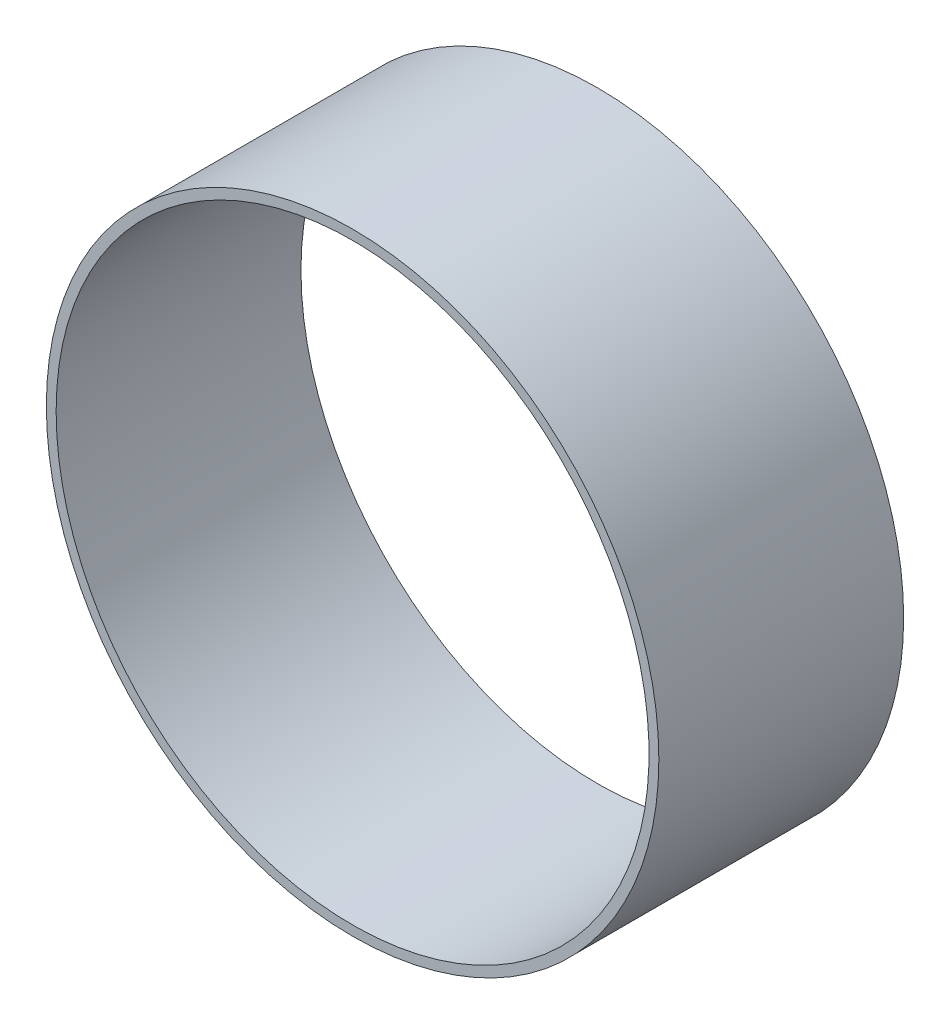
ISO-10303-21;
HEADER;
FILE_DESCRIPTION(('STEP AP214'),'2;1');
FILE_NAME('part.step','',(''),(''),'','','');
FILE_SCHEMA(('AUTOMOTIVE_DESIGN { 1 0 10303 214 1 1 1 1 }'));
ENDSEC;
DATA;
#1=APPLICATION_CONTEXT('core data for automotive mechanical design processes');
#2=APPLICATION_PROTOCOL_DEFINITION('international standard','automotive_design',2000,#1);
#3=PRODUCT_CONTEXT('',#1,'mechanical');
#4=PRODUCT('Part','Part','',(#3));
#5=PRODUCT_RELATED_PRODUCT_CATEGORY('part','',(#4));
#6=PRODUCT_DEFINITION_FORMATION('','',#4);
#7=PRODUCT_DEFINITION_CONTEXT('part definition',#1,'design');
#8=PRODUCT_DEFINITION('design','',#6,#7);
#9=PRODUCT_DEFINITION_SHAPE('','',#8);
#10=(LENGTH_UNIT() NAMED_UNIT(*) SI_UNIT(.MILLI.,.METRE.));
#11=(NAMED_UNIT(*) PLANE_ANGLE_UNIT() SI_UNIT($,.RADIAN.));
#12=(NAMED_UNIT(*) SI_UNIT($,.STERADIAN.) SOLID_ANGLE_UNIT());
#13=UNCERTAINTY_MEASURE_WITH_UNIT(LENGTH_MEASURE(1.E-05),#10,'distance_accuracy_value','');
#14=(GEOMETRIC_REPRESENTATION_CONTEXT(3) GLOBAL_UNCERTAINTY_ASSIGNED_CONTEXT((#13)) GLOBAL_UNIT_ASSIGNED_CONTEXT((#10,
#11,#12)) REPRESENTATION_CONTEXT('',''));
#15=CARTESIAN_POINT('',(0.,0.,0.));
#16=DIRECTION('',(0.,0.,1.));
#17=DIRECTION('',(1.,0.,0.));
#18=AXIS2_PLACEMENT_3D('',#15,#16,#17);
#19=CARTESIAN_POINT('',(38.481,-19.05,-50.8));
#20=DIRECTION('',(0.,0.,-1.));
#21=DIRECTION('',(-1.,0.,0.));
#22=AXIS2_PLACEMENT_3D('',#19,#20,#21);
#23=CYLINDRICAL_SURFACE('',#22,38.44925);
#24=CARTESIAN_POINT('',(38.481,-19.05,15.875));
#25=DIRECTION('',(0.,0.,-1.));
#26=DIRECTION('',(-1.,0.,0.));
#27=AXIS2_PLACEMENT_3D('',#24,#25,#26);
#28=CIRCLE('',#27,38.44925);
#29=CARTESIAN_POINT('',(0.0317499999999971,-19.05,15.875));
#30=VERTEX_POINT('',#29);
#31=EDGE_CURVE('E55',#30,#30,#28,.T.);
#32=ORIENTED_EDGE('',*,*,#31,.F.);
#33=EDGE_LOOP('',(#32));
#34=FACE_BOUND('',#33,.T.);
#35=CARTESIAN_POINT('',(38.481,-19.05,-15.875));
#36=DIRECTION('',(0.,0.,-1.));
#37=DIRECTION('',(-1.,0.,0.));
#38=AXIS2_PLACEMENT_3D('',#35,#36,#37);
#39=CIRCLE('',#38,38.44925);
#40=CARTESIAN_POINT('',(0.0317499999999971,-19.05,-15.875));
#41=VERTEX_POINT('',#40);
#42=EDGE_CURVE('E10',#41,#41,#39,.T.);
#43=ORIENTED_EDGE('',*,*,#42,.T.);
#44=EDGE_LOOP('',(#43));
#45=FACE_BOUND('',#44,.T.);
#46=ADVANCED_FACE('F41',(#34,#45),#23,.F.);
#47=CARTESIAN_POINT('',(76.93025,-19.05,-15.875));
#48=DIRECTION('',(0.,0.,1.));
#49=DIRECTION('',(1.,0.,0.));
#50=AXIS2_PLACEMENT_3D('',#47,#48,#49);
#51=PLANE('',#50);
#52=ORIENTED_EDGE('',*,*,#42,.F.);
#53=EDGE_LOOP('',(#52));
#54=FACE_BOUND('',#53,.T.);
#55=CARTESIAN_POINT('',(38.481,-19.05,-15.875));
#56=DIRECTION('',(0.,0.,-1.));
#57=DIRECTION('',(-1.,0.,0.));
#58=AXIS2_PLACEMENT_3D('',#55,#56,#57);
#59=CIRCLE('',#58,39.71925);
#60=CARTESIAN_POINT('',(-1.23825000000001,-19.05,-15.875));
#61=VERTEX_POINT('',#60);
#62=EDGE_CURVE('E47',#61,#61,#59,.T.);
#63=ORIENTED_EDGE('',*,*,#62,.T.);
#64=EDGE_LOOP('',(#63));
#65=FACE_BOUND('',#64,.T.);
#66=ADVANCED_FACE('F64',(#54,#65),#51,.F.);
#67=CARTESIAN_POINT('',(38.481,-19.05,-50.8));
#68=DIRECTION('',(0.,0.,-1.));
#69=DIRECTION('',(-1.,0.,0.));
#70=AXIS2_PLACEMENT_3D('',#67,#68,#69);
#71=CYLINDRICAL_SURFACE('',#70,39.71925);
#72=ORIENTED_EDGE('',*,*,#62,.F.);
#73=EDGE_LOOP('',(#72));
#74=FACE_BOUND('',#73,.T.);
#75=CARTESIAN_POINT('',(38.481,-19.05,15.875));
#76=DIRECTION('',(0.,0.,-1.));
#77=DIRECTION('',(-1.,0.,0.));
#78=AXIS2_PLACEMENT_3D('',#75,#76,#77);
#79=CIRCLE('',#78,39.71925);
#80=CARTESIAN_POINT('',(-1.23825000000001,-19.05,15.875));
#81=VERTEX_POINT('',#80);
#82=EDGE_CURVE('E51',#81,#81,#79,.T.);
#83=ORIENTED_EDGE('',*,*,#82,.T.);
#84=EDGE_LOOP('',(#83));
#85=FACE_BOUND('',#84,.T.);
#86=ADVANCED_FACE('F68',(#74,#85),#71,.T.);
#87=CARTESIAN_POINT('',(78.20025,-19.05,15.875));
#88=DIRECTION('',(0.,0.,-1.));
#89=DIRECTION('',(-1.,0.,0.));
#90=AXIS2_PLACEMENT_3D('',#87,#88,#89);
#91=PLANE('',#90);
#92=ORIENTED_EDGE('',*,*,#82,.F.);
#93=EDGE_LOOP('',(#92));
#94=FACE_BOUND('',#93,.T.);
#95=ORIENTED_EDGE('',*,*,#31,.T.);
#96=EDGE_LOOP('',(#95));
#97=FACE_BOUND('',#96,.T.);
#98=ADVANCED_FACE('F61',(#94,#97),#91,.F.);
#99=CLOSED_SHELL('',(#46,#66,#86,#98));
#100=MANIFOLD_SOLID_BREP('B2',#99);
#101=ADVANCED_BREP_SHAPE_REPRESENTATION('',(#18,#100),#14);
#102=SHAPE_DEFINITION_REPRESENTATION(#9,#101);
ENDSEC;
END-ISO-10303-21;
